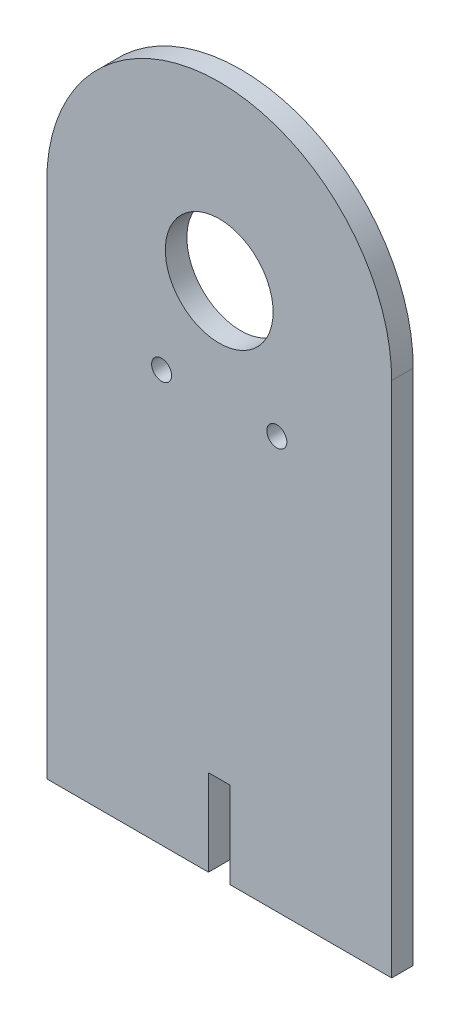
ISO-10303-21;
HEADER;
FILE_DESCRIPTION(('STEP AP214'),'2;1');
FILE_NAME('part.step','',(''),(''),'','','');
FILE_SCHEMA(('AUTOMOTIVE_DESIGN { 1 0 10303 214 1 1 1 1 }'));
ENDSEC;
DATA;
#1=APPLICATION_CONTEXT('core data for automotive mechanical design processes');
#2=APPLICATION_PROTOCOL_DEFINITION('international standard','automotive_design',2000,#1);
#3=PRODUCT_CONTEXT('',#1,'mechanical');
#4=PRODUCT('Part','Part','',(#3));
#5=PRODUCT_RELATED_PRODUCT_CATEGORY('part','',(#4));
#6=PRODUCT_DEFINITION_FORMATION('','',#4);
#7=PRODUCT_DEFINITION_CONTEXT('part definition',#1,'design');
#8=PRODUCT_DEFINITION('design','',#6,#7);
#9=PRODUCT_DEFINITION_SHAPE('','',#8);
#10=(LENGTH_UNIT() NAMED_UNIT(*) SI_UNIT(.MILLI.,.METRE.));
#11=(NAMED_UNIT(*) PLANE_ANGLE_UNIT() SI_UNIT($,.RADIAN.));
#12=(NAMED_UNIT(*) SI_UNIT($,.STERADIAN.) SOLID_ANGLE_UNIT());
#13=UNCERTAINTY_MEASURE_WITH_UNIT(LENGTH_MEASURE(1.E-05),#10,'distance_accuracy_value','');
#14=(GEOMETRIC_REPRESENTATION_CONTEXT(3) GLOBAL_UNCERTAINTY_ASSIGNED_CONTEXT((#13)) GLOBAL_UNIT_ASSIGNED_CONTEXT((#10,
#11,#12)) REPRESENTATION_CONTEXT('',''));
#15=CARTESIAN_POINT('',(0.,0.,0.));
#16=DIRECTION('',(0.,0.,1.));
#17=DIRECTION('',(1.,0.,0.));
#18=AXIS2_PLACEMENT_3D('',#15,#16,#17);
#19=CARTESIAN_POINT('',(0.,0.,3.175));
#20=DIRECTION('',(0.,1.,0.));
#21=DIRECTION('',(0.,0.,1.));
#22=AXIS2_PLACEMENT_3D('',#19,#20,#21);
#23=PLANE('',#22);
#24=DIRECTION('',(1.,0.,0.));
#25=VECTOR('',#24,1.);
#26=CARTESIAN_POINT('',(0.,0.,0.));
#27=LINE('',#26,#25);
#28=CARTESIAN_POINT('',(0.,0.,0.));
#29=VERTEX_POINT('',#28);
#30=CARTESIAN_POINT('',(23.8125,0.,0.));
#31=VERTEX_POINT('',#30);
#32=EDGE_CURVE('E127',#29,#31,#27,.T.);
#33=ORIENTED_EDGE('',*,*,#32,.T.);
#34=DIRECTION('',(0.,0.,1.));
#35=VECTOR('',#34,1.);
#36=CARTESIAN_POINT('',(23.8125,0.,-3.175));
#37=LINE('',#36,#35);
#38=CARTESIAN_POINT('',(23.8125,0.,3.175));
#39=VERTEX_POINT('',#38);
#40=EDGE_CURVE('E117',#31,#39,#37,.T.);
#41=ORIENTED_EDGE('',*,*,#40,.T.);
#42=DIRECTION('',(1.,0.,0.));
#43=VECTOR('',#42,1.);
#44=CARTESIAN_POINT('',(0.,0.,3.175));
#45=LINE('',#44,#43);
#46=CARTESIAN_POINT('',(0.,0.,3.175));
#47=VERTEX_POINT('',#46);
#48=EDGE_CURVE('E93',#47,#39,#45,.T.);
#49=ORIENTED_EDGE('',*,*,#48,.F.);
#50=DIRECTION('',(0.,0.,-1.));
#51=VECTOR('',#50,1.);
#52=CARTESIAN_POINT('',(0.,0.,3.175));
#53=LINE('',#52,#51);
#54=EDGE_CURVE('E169',#47,#29,#53,.T.);
#55=ORIENTED_EDGE('',*,*,#54,.T.);
#56=EDGE_LOOP('',(#33,#41,#49,#55));
#57=FACE_BOUND('',#56,.T.);
#58=ADVANCED_FACE('F39',(#57),#23,.F.);
#59=CARTESIAN_POINT('',(0.,0.,3.175));
#60=DIRECTION('',(1.,0.,0.));
#61=DIRECTION('',(0.,0.,-1.));
#62=AXIS2_PLACEMENT_3D('',#59,#60,#61);
#63=PLANE('',#62);
#64=DIRECTION('',(0.,-1.,0.));
#65=VECTOR('',#64,1.);
#66=CARTESIAN_POINT('',(0.,0.,0.));
#67=LINE('',#66,#65);
#68=CARTESIAN_POINT('',(0.,76.2,0.));
#69=VERTEX_POINT('',#68);
#70=EDGE_CURVE('E148',#69,#29,#67,.T.);
#71=ORIENTED_EDGE('',*,*,#70,.T.);
#72=ORIENTED_EDGE('',*,*,#54,.F.);
#73=DIRECTION('',(0.,-1.,0.));
#74=VECTOR('',#73,1.);
#75=CARTESIAN_POINT('',(0.,0.,3.175));
#76=LINE('',#75,#74);
#77=CARTESIAN_POINT('',(0.,76.2,3.175));
#78=VERTEX_POINT('',#77);
#79=EDGE_CURVE('E134',#78,#47,#76,.T.);
#80=ORIENTED_EDGE('',*,*,#79,.F.);
#81=DIRECTION('',(0.,0.,-1.));
#82=VECTOR('',#81,1.);
#83=CARTESIAN_POINT('',(0.,76.2,3.175));
#84=LINE('',#83,#82);
#85=EDGE_CURVE('E147',#78,#69,#84,.T.);
#86=ORIENTED_EDGE('',*,*,#85,.T.);
#87=EDGE_LOOP('',(#71,#72,#80,#86));
#88=FACE_BOUND('',#87,.T.);
#89=ADVANCED_FACE('F41',(#88),#63,.F.);
#90=CARTESIAN_POINT('',(26.9875,0.,3.175));
#91=VERTEX_POINT('',#90);
#92=CARTESIAN_POINT('',(50.8,0.,3.175));
#93=VERTEX_POINT('',#92);
#94=EDGE_CURVE('E138',#91,#93,#45,.T.);
#95=ORIENTED_EDGE('',*,*,#94,.F.);
#96=DIRECTION('',(0.,0.,1.));
#97=VECTOR('',#96,1.);
#98=CARTESIAN_POINT('',(26.9875,0.,-3.175));
#99=LINE('',#98,#97);
#100=CARTESIAN_POINT('',(26.9875,0.,0.));
#101=VERTEX_POINT('',#100);
#102=EDGE_CURVE('E129',#101,#91,#99,.T.);
#103=ORIENTED_EDGE('',*,*,#102,.F.);
#104=CARTESIAN_POINT('',(50.8,0.,0.));
#105=VERTEX_POINT('',#104);
#106=EDGE_CURVE('E152',#101,#105,#27,.T.);
#107=ORIENTED_EDGE('',*,*,#106,.T.);
#108=DIRECTION('',(0.,0.,-1.));
#109=VECTOR('',#108,1.);
#110=CARTESIAN_POINT('',(50.8,0.,3.175));
#111=LINE('',#110,#109);
#112=EDGE_CURVE('E165',#93,#105,#111,.T.);
#113=ORIENTED_EDGE('',*,*,#112,.F.);
#114=EDGE_LOOP('',(#95,#103,#107,#113));
#115=FACE_BOUND('',#114,.T.);
#116=ADVANCED_FACE('F197',(#115),#23,.F.);
#117=CARTESIAN_POINT('',(50.8,0.,3.175));
#118=DIRECTION('',(-1.,0.,0.));
#119=DIRECTION('',(0.,0.,1.));
#120=AXIS2_PLACEMENT_3D('',#117,#118,#119);
#121=PLANE('',#120);
#122=DIRECTION('',(0.,1.,0.));
#123=VECTOR('',#122,1.);
#124=CARTESIAN_POINT('',(50.8,0.,0.));
#125=LINE('',#124,#123);
#126=CARTESIAN_POINT('',(50.8,76.2,0.));
#127=VERTEX_POINT('',#126);
#128=EDGE_CURVE('E155',#105,#127,#125,.T.);
#129=ORIENTED_EDGE('',*,*,#128,.T.);
#130=DIRECTION('',(0.,0.,-1.));
#131=VECTOR('',#130,1.);
#132=CARTESIAN_POINT('',(50.8,76.2,3.175));
#133=LINE('',#132,#131);
#134=CARTESIAN_POINT('',(50.8,76.2,3.175));
#135=VERTEX_POINT('',#134);
#136=EDGE_CURVE('E162',#135,#127,#133,.T.);
#137=ORIENTED_EDGE('',*,*,#136,.F.);
#138=DIRECTION('',(0.,1.,0.));
#139=VECTOR('',#138,1.);
#140=CARTESIAN_POINT('',(50.8,0.,3.175));
#141=LINE('',#140,#139);
#142=EDGE_CURVE('E137',#93,#135,#141,.T.);
#143=ORIENTED_EDGE('',*,*,#142,.F.);
#144=ORIENTED_EDGE('',*,*,#112,.T.);
#145=EDGE_LOOP('',(#129,#137,#143,#144));
#146=FACE_BOUND('',#145,.T.);
#147=ADVANCED_FACE('F202',(#146),#121,.F.);
#148=CARTESIAN_POINT('',(25.4,76.2,3.175));
#149=DIRECTION('',(0.,0.,-1.));
#150=DIRECTION('',(-1.,0.,0.));
#151=AXIS2_PLACEMENT_3D('',#148,#149,#150);
#152=CYLINDRICAL_SURFACE('',#151,25.4);
#153=CARTESIAN_POINT('',(25.4,76.2,0.));
#154=DIRECTION('',(0.,0.,1.));
#155=DIRECTION('',(1.,0.,0.));
#156=AXIS2_PLACEMENT_3D('',#153,#154,#155);
#157=CIRCLE('',#156,25.4);
#158=EDGE_CURVE('E85',#127,#69,#157,.T.);
#159=ORIENTED_EDGE('',*,*,#158,.T.);
#160=ORIENTED_EDGE('',*,*,#85,.F.);
#161=CARTESIAN_POINT('',(25.4,76.2,3.175));
#162=DIRECTION('',(0.,0.,1.));
#163=DIRECTION('',(1.,0.,0.));
#164=AXIS2_PLACEMENT_3D('',#161,#162,#163);
#165=CIRCLE('',#164,25.4);
#166=EDGE_CURVE('E64',#135,#78,#165,.T.);
#167=ORIENTED_EDGE('',*,*,#166,.F.);
#168=ORIENTED_EDGE('',*,*,#136,.T.);
#169=EDGE_LOOP('',(#159,#160,#167,#168));
#170=FACE_BOUND('',#169,.T.);
#171=ADVANCED_FACE('F203',(#170),#152,.T.);
#172=CARTESIAN_POINT('',(25.4,76.2,3.175));
#173=DIRECTION('',(0.,0.,1.));
#174=DIRECTION('',(1.,0.,0.));
#175=AXIS2_PLACEMENT_3D('',#172,#173,#174);
#176=PLANE('',#175);
#177=CARTESIAN_POINT('',(16.9164,60.6298,3.175));
#178=DIRECTION('',(0.,0.,1.));
#179=DIRECTION('',(1.,0.,0.));
#180=AXIS2_PLACEMENT_3D('',#177,#178,#179);
#181=CIRCLE('',#180,1.47319999999999);
#182=CARTESIAN_POINT('',(18.3896,60.6298,3.175));
#183=VERTEX_POINT('',#182);
#184=EDGE_CURVE('E251',#183,#183,#181,.T.);
#185=ORIENTED_EDGE('',*,*,#184,.F.);
#186=EDGE_LOOP('',(#185));
#187=FACE_BOUND('',#186,.T.);
#188=CARTESIAN_POINT('',(33.8836,60.6298,3.175));
#189=DIRECTION('',(0.,0.,1.));
#190=DIRECTION('',(1.,0.,0.));
#191=AXIS2_PLACEMENT_3D('',#188,#189,#190);
#192=CIRCLE('',#191,1.47319999999999);
#193=CARTESIAN_POINT('',(35.3568,60.6298,3.175));
#194=VERTEX_POINT('',#193);
#195=EDGE_CURVE('E255',#194,#194,#192,.T.);
#196=ORIENTED_EDGE('',*,*,#195,.F.);
#197=EDGE_LOOP('',(#196));
#198=FACE_BOUND('',#197,.T.);
#199=CARTESIAN_POINT('',(25.4,76.2,3.175));
#200=DIRECTION('',(0.,0.,1.));
#201=DIRECTION('',(1.,0.,0.));
#202=AXIS2_PLACEMENT_3D('',#199,#200,#201);
#203=CIRCLE('',#202,7.9375);
#204=CARTESIAN_POINT('',(33.3375,76.2,3.175));
#205=VERTEX_POINT('',#204);
#206=EDGE_CURVE('E265',#205,#205,#203,.T.);
#207=ORIENTED_EDGE('',*,*,#206,.F.);
#208=EDGE_LOOP('',(#207));
#209=FACE_BOUND('',#208,.T.);
#210=DIRECTION('',(0.,-1.,0.));
#211=VECTOR('',#210,1.);
#212=CARTESIAN_POINT('',(23.8125,0.,3.175));
#213=LINE('',#212,#211);
#214=CARTESIAN_POINT('',(23.8125,12.7,3.175));
#215=VERTEX_POINT('',#214);
#216=EDGE_CURVE('E115',#215,#39,#213,.T.);
#217=ORIENTED_EDGE('',*,*,#216,.F.);
#218=DIRECTION('',(-1.,0.,0.));
#219=VECTOR('',#218,1.);
#220=CARTESIAN_POINT('',(23.8125,12.7,3.175));
#221=LINE('',#220,#219);
#222=CARTESIAN_POINT('',(26.9875,12.7,3.175));
#223=VERTEX_POINT('',#222);
#224=EDGE_CURVE('E130',#223,#215,#221,.T.);
#225=ORIENTED_EDGE('',*,*,#224,.F.);
#226=DIRECTION('',(0.,1.,0.));
#227=VECTOR('',#226,1.);
#228=CARTESIAN_POINT('',(26.9875,0.,3.175));
#229=LINE('',#228,#227);
#230=EDGE_CURVE('E123',#91,#223,#229,.T.);
#231=ORIENTED_EDGE('',*,*,#230,.F.);
#232=ORIENTED_EDGE('',*,*,#94,.T.);
#233=ORIENTED_EDGE('',*,*,#142,.T.);
#234=ORIENTED_EDGE('',*,*,#166,.T.);
#235=ORIENTED_EDGE('',*,*,#79,.T.);
#236=ORIENTED_EDGE('',*,*,#48,.T.);
#237=EDGE_LOOP('',(#217,#225,#231,#232,#233,#234,#235,#236));
#238=FACE_BOUND('',#237,.T.);
#239=ADVANCED_FACE('F132',(#187,#198,#209,#238),#176,.T.);
#240=CARTESIAN_POINT('',(25.4,76.2,0.));
#241=DIRECTION('',(0.,0.,1.));
#242=DIRECTION('',(1.,0.,0.));
#243=AXIS2_PLACEMENT_3D('',#240,#241,#242);
#244=PLANE('',#243);
#245=CARTESIAN_POINT('',(16.9164,60.6298,0.));
#246=DIRECTION('',(0.,0.,1.));
#247=DIRECTION('',(1.,0.,0.));
#248=AXIS2_PLACEMENT_3D('',#245,#246,#247);
#249=CIRCLE('',#248,1.4732);
#250=CARTESIAN_POINT('',(18.3896,60.6298,0.));
#251=VERTEX_POINT('',#250);
#252=EDGE_CURVE('E248',#251,#251,#249,.T.);
#253=ORIENTED_EDGE('',*,*,#252,.T.);
#254=EDGE_LOOP('',(#253));
#255=FACE_BOUND('',#254,.T.);
#256=CARTESIAN_POINT('',(33.8836,60.6298,0.));
#257=DIRECTION('',(0.,0.,1.));
#258=DIRECTION('',(1.,0.,0.));
#259=AXIS2_PLACEMENT_3D('',#256,#257,#258);
#260=CIRCLE('',#259,1.4732);
#261=CARTESIAN_POINT('',(35.3568,60.6298,0.));
#262=VERTEX_POINT('',#261);
#263=EDGE_CURVE('E261',#262,#262,#260,.T.);
#264=ORIENTED_EDGE('',*,*,#263,.T.);
#265=EDGE_LOOP('',(#264));
#266=FACE_BOUND('',#265,.T.);
#267=CARTESIAN_POINT('',(25.4,76.2,0.));
#268=DIRECTION('',(0.,0.,1.));
#269=DIRECTION('',(1.,0.,0.));
#270=AXIS2_PLACEMENT_3D('',#267,#268,#269);
#271=CIRCLE('',#270,7.9375);
#272=CARTESIAN_POINT('',(33.3375,76.2,0.));
#273=VERTEX_POINT('',#272);
#274=EDGE_CURVE('E124',#273,#273,#271,.T.);
#275=ORIENTED_EDGE('',*,*,#274,.T.);
#276=EDGE_LOOP('',(#275));
#277=FACE_BOUND('',#276,.T.);
#278=DIRECTION('',(-1.,0.,0.));
#279=VECTOR('',#278,1.);
#280=CARTESIAN_POINT('',(25.4,12.7,0.));
#281=LINE('',#280,#279);
#282=CARTESIAN_POINT('',(26.9875,12.7,0.));
#283=VERTEX_POINT('',#282);
#284=CARTESIAN_POINT('',(23.8125,12.7,0.));
#285=VERTEX_POINT('',#284);
#286=EDGE_CURVE('E48',#283,#285,#281,.T.);
#287=ORIENTED_EDGE('',*,*,#286,.T.);
#288=DIRECTION('',(0.,-1.,0.));
#289=VECTOR('',#288,1.);
#290=CARTESIAN_POINT('',(23.8125,76.2,0.));
#291=LINE('',#290,#289);
#292=EDGE_CURVE('E11',#285,#31,#291,.T.);
#293=ORIENTED_EDGE('',*,*,#292,.T.);
#294=ORIENTED_EDGE('',*,*,#32,.F.);
#295=ORIENTED_EDGE('',*,*,#70,.F.);
#296=ORIENTED_EDGE('',*,*,#158,.F.);
#297=ORIENTED_EDGE('',*,*,#128,.F.);
#298=ORIENTED_EDGE('',*,*,#106,.F.);
#299=DIRECTION('',(0.,1.,0.));
#300=VECTOR('',#299,1.);
#301=CARTESIAN_POINT('',(26.9875,76.2,0.));
#302=LINE('',#301,#300);
#303=EDGE_CURVE('E172',#101,#283,#302,.T.);
#304=ORIENTED_EDGE('',*,*,#303,.T.);
#305=EDGE_LOOP('',(#287,#293,#294,#295,#296,#297,#298,#304));
#306=FACE_BOUND('',#305,.T.);
#307=ADVANCED_FACE('F178',(#255,#266,#277,#306),#244,.F.);
#308=CARTESIAN_POINT('',(23.8125,0.,-3.175));
#309=DIRECTION('',(-1.,0.,0.));
#310=DIRECTION('',(0.,0.,1.));
#311=AXIS2_PLACEMENT_3D('',#308,#309,#310);
#312=PLANE('',#311);
#313=DIRECTION('',(0.,0.,1.));
#314=VECTOR('',#313,1.);
#315=CARTESIAN_POINT('',(23.8125,12.7,-3.175));
#316=LINE('',#315,#314);
#317=EDGE_CURVE('E119',#285,#215,#316,.T.);
#318=ORIENTED_EDGE('',*,*,#317,.T.);
#319=ORIENTED_EDGE('',*,*,#216,.T.);
#320=ORIENTED_EDGE('',*,*,#40,.F.);
#321=ORIENTED_EDGE('',*,*,#292,.F.);
#322=EDGE_LOOP('',(#318,#319,#320,#321));
#323=FACE_BOUND('',#322,.T.);
#324=ADVANCED_FACE('F116',(#323),#312,.F.);
#325=CARTESIAN_POINT('',(23.8125,12.7,-3.175));
#326=DIRECTION('',(0.,1.,0.));
#327=DIRECTION('',(0.,0.,1.));
#328=AXIS2_PLACEMENT_3D('',#325,#326,#327);
#329=PLANE('',#328);
#330=DIRECTION('',(0.,0.,1.));
#331=VECTOR('',#330,1.);
#332=CARTESIAN_POINT('',(26.9875,12.7,-3.175));
#333=LINE('',#332,#331);
#334=EDGE_CURVE('E55',#283,#223,#333,.T.);
#335=ORIENTED_EDGE('',*,*,#334,.T.);
#336=ORIENTED_EDGE('',*,*,#224,.T.);
#337=ORIENTED_EDGE('',*,*,#317,.F.);
#338=ORIENTED_EDGE('',*,*,#286,.F.);
#339=EDGE_LOOP('',(#335,#336,#337,#338));
#340=FACE_BOUND('',#339,.T.);
#341=ADVANCED_FACE('F181',(#340),#329,.F.);
#342=CARTESIAN_POINT('',(26.9875,0.,-3.175));
#343=DIRECTION('',(1.,0.,0.));
#344=DIRECTION('',(0.,1.,0.));
#345=AXIS2_PLACEMENT_3D('',#342,#343,#344);
#346=PLANE('',#345);
#347=ORIENTED_EDGE('',*,*,#102,.T.);
#348=ORIENTED_EDGE('',*,*,#230,.T.);
#349=ORIENTED_EDGE('',*,*,#334,.F.);
#350=ORIENTED_EDGE('',*,*,#303,.F.);
#351=EDGE_LOOP('',(#347,#348,#349,#350));
#352=FACE_BOUND('',#351,.T.);
#353=ADVANCED_FACE('F192',(#352),#346,.F.);
#354=CARTESIAN_POINT('',(25.4,76.2,3.175));
#355=DIRECTION('',(0.,0.,1.));
#356=DIRECTION('',(1.,0.,0.));
#357=AXIS2_PLACEMENT_3D('',#354,#355,#356);
#358=CYLINDRICAL_SURFACE('',#357,7.9375);
#359=ORIENTED_EDGE('',*,*,#274,.F.);
#360=EDGE_LOOP('',(#359));
#361=FACE_BOUND('',#360,.T.);
#362=ORIENTED_EDGE('',*,*,#206,.T.);
#363=EDGE_LOOP('',(#362));
#364=FACE_BOUND('',#363,.T.);
#365=ADVANCED_FACE('F230',(#361,#364),#358,.F.);
#366=CARTESIAN_POINT('',(33.8836,60.6298,3.175));
#367=DIRECTION('',(0.,0.,1.));
#368=DIRECTION('',(1.,0.,0.));
#369=AXIS2_PLACEMENT_3D('',#366,#367,#368);
#370=CYLINDRICAL_SURFACE('',#369,1.4732);
#371=ORIENTED_EDGE('',*,*,#263,.F.);
#372=EDGE_LOOP('',(#371));
#373=FACE_BOUND('',#372,.T.);
#374=ORIENTED_EDGE('',*,*,#195,.T.);
#375=EDGE_LOOP('',(#374));
#376=FACE_BOUND('',#375,.T.);
#377=ADVANCED_FACE('F235',(#373,#376),#370,.F.);
#378=CARTESIAN_POINT('',(16.9164,60.6298,3.175));
#379=DIRECTION('',(0.,0.,1.));
#380=DIRECTION('',(1.,0.,0.));
#381=AXIS2_PLACEMENT_3D('',#378,#379,#380);
#382=CYLINDRICAL_SURFACE('',#381,1.4732);
#383=ORIENTED_EDGE('',*,*,#252,.F.);
#384=EDGE_LOOP('',(#383));
#385=FACE_BOUND('',#384,.T.);
#386=ORIENTED_EDGE('',*,*,#184,.T.);
#387=EDGE_LOOP('',(#386));
#388=FACE_BOUND('',#387,.T.);
#389=ADVANCED_FACE('F239',(#385,#388),#382,.F.);
#390=CLOSED_SHELL('',(#58,#89,#116,#147,#171,#239,#307,#324,#341,#353,#365,#377,#389));
#391=MANIFOLD_SOLID_BREP('B2',#390);
#392=ADVANCED_BREP_SHAPE_REPRESENTATION('',(#18,#391),#14);
#393=SHAPE_DEFINITION_REPRESENTATION(#9,#392);
ENDSEC;
END-ISO-10303-21;
